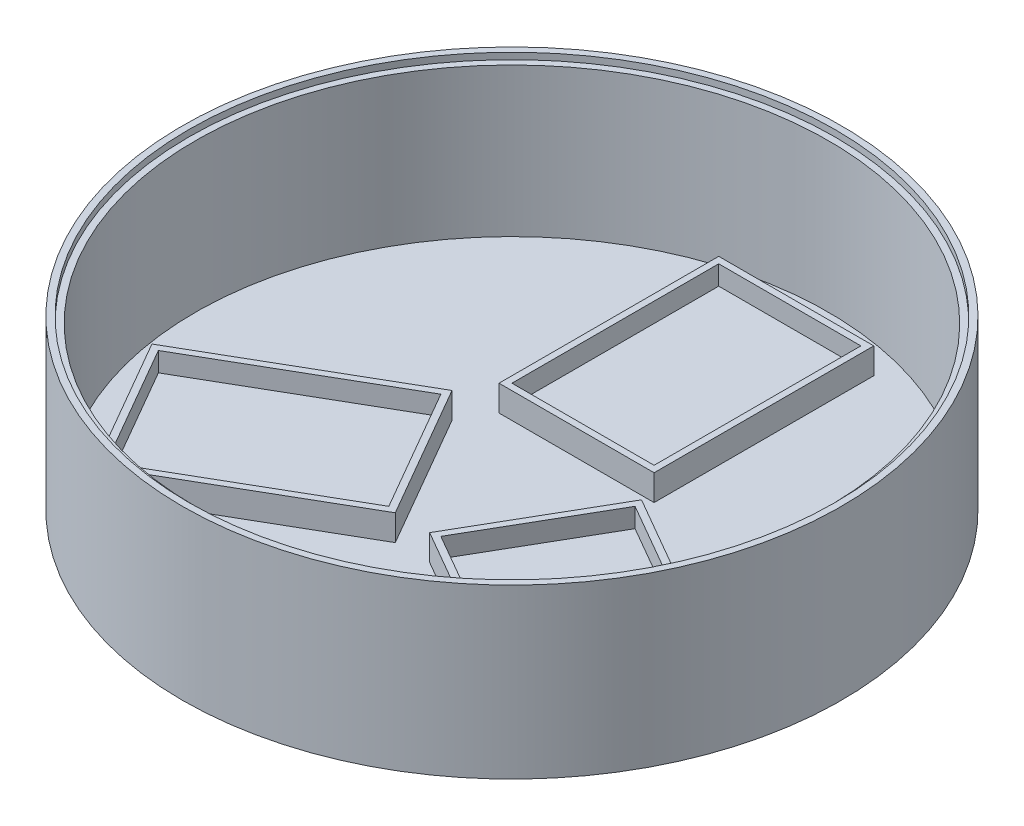
ISO-10303-21;
HEADER;
FILE_DESCRIPTION(('STEP AP214'),'2;1');
FILE_NAME('part.step','',(''),(''),'','','');
FILE_SCHEMA(('AUTOMOTIVE_DESIGN { 1 0 10303 214 1 1 1 1 }'));
ENDSEC;
DATA;
#1=APPLICATION_CONTEXT('core data for automotive mechanical design processes');
#2=APPLICATION_PROTOCOL_DEFINITION('international standard','automotive_design',2000,#1);
#3=PRODUCT_CONTEXT('',#1,'mechanical');
#4=PRODUCT('Part','Part','',(#3));
#5=PRODUCT_RELATED_PRODUCT_CATEGORY('part','',(#4));
#6=PRODUCT_DEFINITION_FORMATION('','',#4);
#7=PRODUCT_DEFINITION_CONTEXT('part definition',#1,'design');
#8=PRODUCT_DEFINITION('design','',#6,#7);
#9=PRODUCT_DEFINITION_SHAPE('','',#8);
#10=(LENGTH_UNIT() NAMED_UNIT(*) SI_UNIT(.MILLI.,.METRE.));
#11=(NAMED_UNIT(*) PLANE_ANGLE_UNIT() SI_UNIT($,.RADIAN.));
#12=(NAMED_UNIT(*) SI_UNIT($,.STERADIAN.) SOLID_ANGLE_UNIT());
#13=UNCERTAINTY_MEASURE_WITH_UNIT(LENGTH_MEASURE(1.E-05),#10,'distance_accuracy_value','');
#14=(GEOMETRIC_REPRESENTATION_CONTEXT(3) GLOBAL_UNCERTAINTY_ASSIGNED_CONTEXT((#13)) GLOBAL_UNIT_ASSIGNED_CONTEXT((#10,
#11,#12)) REPRESENTATION_CONTEXT('',''));
#15=CARTESIAN_POINT('',(0.,0.,0.));
#16=DIRECTION('',(0.,0.,1.));
#17=DIRECTION('',(1.,0.,0.));
#18=AXIS2_PLACEMENT_3D('',#15,#16,#17);
#19=CARTESIAN_POINT('',(0.,125.,0.));
#20=DIRECTION('',(0.,1.,0.));
#21=DIRECTION('',(0.,0.,1.));
#22=AXIS2_PLACEMENT_3D('',#19,#20,#21);
#23=PLANE('',#22);
#24=CARTESIAN_POINT('',(0.,125.,0.));
#25=DIRECTION('',(0.,1.,0.));
#26=DIRECTION('',(0.,0.,1.));
#27=AXIS2_PLACEMENT_3D('',#24,#25,#26);
#28=CIRCLE('',#27,245.);
#29=CARTESIAN_POINT('',(0.,125.,245.));
#30=VERTEX_POINT('',#29);
#31=EDGE_CURVE('E50',#30,#30,#28,.T.);
#32=ORIENTED_EDGE('',*,*,#31,.F.);
#33=EDGE_LOOP('',(#32));
#34=FACE_BOUND('',#33,.T.);
#35=CARTESIAN_POINT('',(0.,125.,0.));
#36=DIRECTION('',(0.,1.,0.));
#37=DIRECTION('',(0.,0.,1.));
#38=AXIS2_PLACEMENT_3D('',#35,#36,#37);
#39=CIRCLE('',#38,250.);
#40=CARTESIAN_POINT('',(0.,125.,250.));
#41=VERTEX_POINT('',#40);
#42=EDGE_CURVE('E331',#41,#41,#39,.T.);
#43=ORIENTED_EDGE('',*,*,#42,.T.);
#44=EDGE_LOOP('',(#43));
#45=FACE_BOUND('',#44,.T.);
#46=ADVANCED_FACE('F41',(#34,#45),#23,.T.);
#47=CARTESIAN_POINT('',(0.,10.,0.));
#48=DIRECTION('',(0.,1.,0.));
#49=DIRECTION('',(0.,0.,1.));
#50=AXIS2_PLACEMENT_3D('',#47,#48,#49);
#51=PLANE('',#50);
#52=CARTESIAN_POINT('',(0.,9.99999999999999,0.));
#53=DIRECTION('',(0.,1.,0.));
#54=DIRECTION('',(0.,0.,1.));
#55=AXIS2_PLACEMENT_3D('',#52,#53,#54);
#56=CIRCLE('',#55,245.);
#57=CARTESIAN_POINT('',(0.,9.99999999999999,245.));
#58=VERTEX_POINT('',#57);
#59=EDGE_CURVE('E474',#58,#58,#56,.T.);
#60=ORIENTED_EDGE('',*,*,#59,.T.);
#61=EDGE_LOOP('',(#60));
#62=FACE_BOUND('',#61,.T.);
#63=DIRECTION('',(-1.,0.,0.));
#64=VECTOR('',#63,1.);
#65=CARTESIAN_POINT('',(-60.,10.,-220.));
#66=LINE('',#65,#64);
#67=CARTESIAN_POINT('',(60.,10.,-220.));
#68=VERTEX_POINT('',#67);
#69=CARTESIAN_POINT('',(-60.,10.,-220.));
#70=VERTEX_POINT('',#69);
#71=EDGE_CURVE('E452',#68,#70,#66,.T.);
#72=ORIENTED_EDGE('',*,*,#71,.F.);
#73=DIRECTION('',(0.,0.,-1.));
#74=VECTOR('',#73,1.);
#75=CARTESIAN_POINT('',(60.,10.,-50.));
#76=LINE('',#75,#74);
#77=CARTESIAN_POINT('',(60.,10.,-50.));
#78=VERTEX_POINT('',#77);
#79=EDGE_CURVE('E433',#78,#68,#76,.T.);
#80=ORIENTED_EDGE('',*,*,#79,.F.);
#81=DIRECTION('',(1.,0.,0.));
#82=VECTOR('',#81,1.);
#83=CARTESIAN_POINT('',(-60.,10.,-50.));
#84=LINE('',#83,#82);
#85=CARTESIAN_POINT('',(-60.,10.,-50.));
#86=VERTEX_POINT('',#85);
#87=EDGE_CURVE('E439',#86,#78,#84,.T.);
#88=ORIENTED_EDGE('',*,*,#87,.F.);
#89=DIRECTION('',(0.,0.,1.));
#90=VECTOR('',#89,1.);
#91=CARTESIAN_POINT('',(-60.,10.,-50.));
#92=LINE('',#91,#90);
#93=EDGE_CURVE('E455',#70,#86,#92,.T.);
#94=ORIENTED_EDGE('',*,*,#93,.F.);
#95=EDGE_LOOP('',(#72,#80,#88,#94));
#96=FACE_BOUND('',#95,.T.);
#97=DIRECTION('',(-0.866025403784439,0.,-0.5));
#98=VECTOR('',#97,1.);
#99=CARTESIAN_POINT('',(73.3012701892239,10.,-26.9615242270708));
#100=LINE('',#99,#98);
#101=CARTESIAN_POINT('',(220.525588832578,10.,58.0384757729292));
#102=VERTEX_POINT('',#101);
#103=CARTESIAN_POINT('',(73.3012701892239,10.,-26.9615242270708));
#104=VERTEX_POINT('',#103);
#105=EDGE_CURVE('E411',#102,#104,#100,.T.);
#106=ORIENTED_EDGE('',*,*,#105,.F.);
#107=DIRECTION('',(0.5,0.,-0.866025403784439));
#108=VECTOR('',#107,1.);
#109=CARTESIAN_POINT('',(220.525588832578,10.,58.0384757729292));
#110=LINE('',#109,#108);
#111=CARTESIAN_POINT('',(160.525588832579,10.,161.961524227062));
#112=VERTEX_POINT('',#111);
#113=EDGE_CURVE('E392',#112,#102,#110,.T.);
#114=ORIENTED_EDGE('',*,*,#113,.F.);
#115=DIRECTION('',(0.866025403784439,0.,0.5));
#116=VECTOR('',#115,1.);
#117=CARTESIAN_POINT('',(13.3012701892239,10.,76.9615242270619));
#118=LINE('',#117,#116);
#119=CARTESIAN_POINT('',(13.3012701892239,10.,76.9615242270618));
#120=VERTEX_POINT('',#119);
#121=EDGE_CURVE('E398',#120,#112,#118,.T.);
#122=ORIENTED_EDGE('',*,*,#121,.F.);
#123=DIRECTION('',(-0.5,0.,0.866025403784439));
#124=VECTOR('',#123,1.);
#125=CARTESIAN_POINT('',(73.3012701892239,10.,-26.9615242270708));
#126=LINE('',#125,#124);
#127=EDGE_CURVE('E414',#104,#120,#126,.T.);
#128=ORIENTED_EDGE('',*,*,#127,.F.);
#129=EDGE_LOOP('',(#106,#114,#122,#128));
#130=FACE_BOUND('',#129,.T.);
#131=DIRECTION('',(0.866025403784438,0.,-0.5));
#132=VECTOR('',#131,1.);
#133=CARTESIAN_POINT('',(-13.3012701892171,10.,76.9615242270658));
#134=LINE('',#133,#132);
#135=CARTESIAN_POINT('',(-160.525588832572,10.,161.961524227066));
#136=VERTEX_POINT('',#135);
#137=CARTESIAN_POINT('',(-13.3012701892171,10.,76.9615242270658));
#138=VERTEX_POINT('',#137);
#139=EDGE_CURVE('E370',#136,#138,#134,.T.);
#140=ORIENTED_EDGE('',*,*,#139,.F.);
#141=DIRECTION('',(0.5,0.,0.866025403784438));
#142=VECTOR('',#141,1.);
#143=CARTESIAN_POINT('',(-160.525588832572,10.,161.961524227066));
#144=LINE('',#143,#142);
#145=CARTESIAN_POINT('',(-220.525588832572,10.,58.0384757729333));
#146=VERTEX_POINT('',#145);
#147=EDGE_CURVE('E351',#146,#136,#144,.T.);
#148=ORIENTED_EDGE('',*,*,#147,.F.);
#149=DIRECTION('',(-0.866025403784438,0.,0.5));
#150=VECTOR('',#149,1.);
#151=CARTESIAN_POINT('',(-73.3012701892171,10.,-26.9615242270668));
#152=LINE('',#151,#150);
#153=CARTESIAN_POINT('',(-73.3012701892171,10.,-26.9615242270668));
#154=VERTEX_POINT('',#153);
#155=EDGE_CURVE('E357',#154,#146,#152,.T.);
#156=ORIENTED_EDGE('',*,*,#155,.F.);
#157=DIRECTION('',(-0.5,0.,-0.866025403784438));
#158=VECTOR('',#157,1.);
#159=CARTESIAN_POINT('',(-13.3012701892171,10.,76.9615242270658));
#160=LINE('',#159,#158);
#161=EDGE_CURVE('E373',#138,#154,#160,.T.);
#162=ORIENTED_EDGE('',*,*,#161,.F.);
#163=EDGE_LOOP('',(#140,#148,#156,#162));
#164=FACE_BOUND('',#163,.T.);
#165=ADVANCED_FACE('F486',(#62,#96,#130,#164),#51,.T.);
#166=CARTESIAN_POINT('',(0.,125.,0.));
#167=DIRECTION('',(0.,-1.,0.));
#168=DIRECTION('',(0.,0.,-1.));
#169=AXIS2_PLACEMENT_3D('',#166,#167,#168);
#170=CYLINDRICAL_SURFACE('',#169,245.);
#171=ORIENTED_EDGE('',*,*,#31,.T.);
#172=EDGE_LOOP('',(#171));
#173=FACE_BOUND('',#172,.T.);
#174=ORIENTED_EDGE('',*,*,#59,.F.);
#175=EDGE_LOOP('',(#174));
#176=FACE_BOUND('',#175,.T.);
#177=ADVANCED_FACE('F481',(#173,#176),#170,.F.);
#178=CARTESIAN_POINT('',(60.,30.,-50.));
#179=DIRECTION('',(-1.,0.,0.));
#180=DIRECTION('',(0.,0.,1.));
#181=AXIS2_PLACEMENT_3D('',#178,#179,#180);
#182=PLANE('',#181);
#183=ORIENTED_EDGE('',*,*,#79,.T.);
#184=DIRECTION('',(0.,-1.,0.));
#185=VECTOR('',#184,1.);
#186=CARTESIAN_POINT('',(60.,30.,-220.));
#187=LINE('',#186,#185);
#188=CARTESIAN_POINT('',(60.,30.,-220.));
#189=VERTEX_POINT('',#188);
#190=EDGE_CURVE('E471',#189,#68,#187,.T.);
#191=ORIENTED_EDGE('',*,*,#190,.F.);
#192=DIRECTION('',(0.,0.,-1.));
#193=VECTOR('',#192,1.);
#194=CARTESIAN_POINT('',(60.,30.,-50.));
#195=LINE('',#194,#193);
#196=CARTESIAN_POINT('',(60.,30.,-50.));
#197=VERTEX_POINT('',#196);
#198=EDGE_CURVE('E434',#197,#189,#195,.T.);
#199=ORIENTED_EDGE('',*,*,#198,.F.);
#200=DIRECTION('',(0.,-1.,0.));
#201=VECTOR('',#200,1.);
#202=CARTESIAN_POINT('',(60.,30.,-50.));
#203=LINE('',#202,#201);
#204=EDGE_CURVE('E448',#197,#78,#203,.T.);
#205=ORIENTED_EDGE('',*,*,#204,.T.);
#206=EDGE_LOOP('',(#183,#191,#199,#205));
#207=FACE_BOUND('',#206,.T.);
#208=ADVANCED_FACE('F562',(#207),#182,.F.);
#209=CARTESIAN_POINT('',(-60.,30.,-220.));
#210=DIRECTION('',(0.,0.,1.));
#211=DIRECTION('',(1.,0.,0.));
#212=AXIS2_PLACEMENT_3D('',#209,#210,#211);
#213=PLANE('',#212);
#214=ORIENTED_EDGE('',*,*,#71,.T.);
#215=DIRECTION('',(0.,-1.,0.));
#216=VECTOR('',#215,1.);
#217=CARTESIAN_POINT('',(-60.,30.,-220.));
#218=LINE('',#217,#216);
#219=CARTESIAN_POINT('',(-60.,30.,-220.));
#220=VERTEX_POINT('',#219);
#221=EDGE_CURVE('E467',#220,#70,#218,.T.);
#222=ORIENTED_EDGE('',*,*,#221,.F.);
#223=DIRECTION('',(-1.,0.,0.));
#224=VECTOR('',#223,1.);
#225=CARTESIAN_POINT('',(-60.,30.,-220.));
#226=LINE('',#225,#224);
#227=EDGE_CURVE('E438',#189,#220,#226,.T.);
#228=ORIENTED_EDGE('',*,*,#227,.F.);
#229=ORIENTED_EDGE('',*,*,#190,.T.);
#230=EDGE_LOOP('',(#214,#222,#228,#229));
#231=FACE_BOUND('',#230,.T.);
#232=ADVANCED_FACE('F558',(#231),#213,.F.);
#233=CARTESIAN_POINT('',(-60.,30.,-50.));
#234=DIRECTION('',(1.,0.,0.));
#235=DIRECTION('',(0.,0.,-1.));
#236=AXIS2_PLACEMENT_3D('',#233,#234,#235);
#237=PLANE('',#236);
#238=ORIENTED_EDGE('',*,*,#93,.T.);
#239=DIRECTION('',(0.,-1.,0.));
#240=VECTOR('',#239,1.);
#241=CARTESIAN_POINT('',(-60.,30.,-50.));
#242=LINE('',#241,#240);
#243=CARTESIAN_POINT('',(-60.,30.,-50.));
#244=VERTEX_POINT('',#243);
#245=EDGE_CURVE('E464',#244,#86,#242,.T.);
#246=ORIENTED_EDGE('',*,*,#245,.F.);
#247=DIRECTION('',(0.,0.,1.));
#248=VECTOR('',#247,1.);
#249=CARTESIAN_POINT('',(-60.,30.,-50.));
#250=LINE('',#249,#248);
#251=EDGE_CURVE('E442',#220,#244,#250,.T.);
#252=ORIENTED_EDGE('',*,*,#251,.F.);
#253=ORIENTED_EDGE('',*,*,#221,.T.);
#254=EDGE_LOOP('',(#238,#246,#252,#253));
#255=FACE_BOUND('',#254,.T.);
#256=ADVANCED_FACE('F554',(#255),#237,.F.);
#257=CARTESIAN_POINT('',(-60.,30.,-50.));
#258=DIRECTION('',(0.,0.,-1.));
#259=DIRECTION('',(-1.,0.,0.));
#260=AXIS2_PLACEMENT_3D('',#257,#258,#259);
#261=PLANE('',#260);
#262=ORIENTED_EDGE('',*,*,#87,.T.);
#263=ORIENTED_EDGE('',*,*,#204,.F.);
#264=DIRECTION('',(1.,0.,0.));
#265=VECTOR('',#264,1.);
#266=CARTESIAN_POINT('',(-60.,30.,-50.));
#267=LINE('',#266,#265);
#268=EDGE_CURVE('E445',#244,#197,#267,.T.);
#269=ORIENTED_EDGE('',*,*,#268,.F.);
#270=ORIENTED_EDGE('',*,*,#245,.T.);
#271=EDGE_LOOP('',(#262,#263,#269,#270));
#272=FACE_BOUND('',#271,.T.);
#273=ADVANCED_FACE('F550',(#272),#261,.F.);
#274=CARTESIAN_POINT('',(0.,30.,0.));
#275=DIRECTION('',(0.,-1.,0.));
#276=DIRECTION('',(0.,0.,-1.));
#277=AXIS2_PLACEMENT_3D('',#274,#275,#276);
#278=PLANE('',#277);
#279=DIRECTION('',(0.,0.,-1.));
#280=VECTOR('',#279,1.);
#281=CARTESIAN_POINT('',(55.,30.,-55.));
#282=LINE('',#281,#280);
#283=CARTESIAN_POINT('',(55.,30.,-55.));
#284=VERTEX_POINT('',#283);
#285=CARTESIAN_POINT('',(55.,30.,-215.));
#286=VERTEX_POINT('',#285);
#287=EDGE_CURVE('E239',#284,#286,#282,.T.);
#288=ORIENTED_EDGE('',*,*,#287,.F.);
#289=DIRECTION('',(1.,0.,0.));
#290=VECTOR('',#289,1.);
#291=CARTESIAN_POINT('',(-55.,30.,-55.));
#292=LINE('',#291,#290);
#293=CARTESIAN_POINT('',(-55.,30.,-55.));
#294=VERTEX_POINT('',#293);
#295=EDGE_CURVE('E57',#294,#284,#292,.T.);
#296=ORIENTED_EDGE('',*,*,#295,.F.);
#297=DIRECTION('',(0.,0.,1.));
#298=VECTOR('',#297,1.);
#299=CARTESIAN_POINT('',(-55.,30.,-215.));
#300=LINE('',#299,#298);
#301=CARTESIAN_POINT('',(-55.,30.,-215.));
#302=VERTEX_POINT('',#301);
#303=EDGE_CURVE('E226',#302,#294,#300,.T.);
#304=ORIENTED_EDGE('',*,*,#303,.F.);
#305=DIRECTION('',(-1.,0.,0.));
#306=VECTOR('',#305,1.);
#307=CARTESIAN_POINT('',(55.,30.,-215.));
#308=LINE('',#307,#306);
#309=EDGE_CURVE('E230',#286,#302,#308,.T.);
#310=ORIENTED_EDGE('',*,*,#309,.F.);
#311=EDGE_LOOP('',(#288,#296,#304,#310));
#312=FACE_BOUND('',#311,.T.);
#313=ORIENTED_EDGE('',*,*,#198,.T.);
#314=ORIENTED_EDGE('',*,*,#227,.T.);
#315=ORIENTED_EDGE('',*,*,#251,.T.);
#316=ORIENTED_EDGE('',*,*,#268,.T.);
#317=EDGE_LOOP('',(#313,#314,#315,#316));
#318=FACE_BOUND('',#317,.T.);
#319=ADVANCED_FACE('F546',(#312,#318),#278,.F.);
#320=CARTESIAN_POINT('',(220.525588832578,30.,58.0384757729292));
#321=DIRECTION('',(-0.866025403784439,0.,-0.5));
#322=DIRECTION('',(-0.5,0.,0.866025403784439));
#323=AXIS2_PLACEMENT_3D('',#320,#321,#322);
#324=PLANE('',#323);
#325=ORIENTED_EDGE('',*,*,#113,.T.);
#326=DIRECTION('',(0.,-1.,0.));
#327=VECTOR('',#326,1.);
#328=CARTESIAN_POINT('',(220.525588832578,30.,58.0384757729292));
#329=LINE('',#328,#327);
#330=CARTESIAN_POINT('',(220.525588832578,30.,58.0384757729292));
#331=VERTEX_POINT('',#330);
#332=EDGE_CURVE('E430',#331,#102,#329,.T.);
#333=ORIENTED_EDGE('',*,*,#332,.F.);
#334=DIRECTION('',(0.5,0.,-0.866025403784439));
#335=VECTOR('',#334,1.);
#336=CARTESIAN_POINT('',(220.525588832578,30.,58.0384757729292));
#337=LINE('',#336,#335);
#338=CARTESIAN_POINT('',(160.525588832579,30.,161.961524227062));
#339=VERTEX_POINT('',#338);
#340=EDGE_CURVE('E393',#339,#331,#337,.T.);
#341=ORIENTED_EDGE('',*,*,#340,.F.);
#342=DIRECTION('',(0.,-1.,0.));
#343=VECTOR('',#342,1.);
#344=CARTESIAN_POINT('',(160.525588832579,30.,161.961524227062));
#345=LINE('',#344,#343);
#346=EDGE_CURVE('E407',#339,#112,#345,.T.);
#347=ORIENTED_EDGE('',*,*,#346,.T.);
#348=EDGE_LOOP('',(#325,#333,#341,#347));
#349=FACE_BOUND('',#348,.T.);
#350=ADVANCED_FACE('F542',(#349),#324,.F.);
#351=CARTESIAN_POINT('',(73.3012701892239,30.,-26.9615242270708));
#352=DIRECTION('',(-0.5,0.,0.866025403784439));
#353=DIRECTION('',(0.866025403784439,0.,0.5));
#354=AXIS2_PLACEMENT_3D('',#351,#352,#353);
#355=PLANE('',#354);
#356=ORIENTED_EDGE('',*,*,#105,.T.);
#357=DIRECTION('',(0.,-1.,0.));
#358=VECTOR('',#357,1.);
#359=CARTESIAN_POINT('',(73.3012701892239,30.,-26.9615242270708));
#360=LINE('',#359,#358);
#361=CARTESIAN_POINT('',(73.3012701892239,30.,-26.9615242270708));
#362=VERTEX_POINT('',#361);
#363=EDGE_CURVE('E426',#362,#104,#360,.T.);
#364=ORIENTED_EDGE('',*,*,#363,.F.);
#365=DIRECTION('',(-0.866025403784439,0.,-0.5));
#366=VECTOR('',#365,1.);
#367=CARTESIAN_POINT('',(73.3012701892239,30.,-26.9615242270708));
#368=LINE('',#367,#366);
#369=EDGE_CURVE('E397',#331,#362,#368,.T.);
#370=ORIENTED_EDGE('',*,*,#369,.F.);
#371=ORIENTED_EDGE('',*,*,#332,.T.);
#372=EDGE_LOOP('',(#356,#364,#370,#371));
#373=FACE_BOUND('',#372,.T.);
#374=ADVANCED_FACE('F538',(#373),#355,.F.);
#375=CARTESIAN_POINT('',(73.3012701892239,30.,-26.9615242270708));
#376=DIRECTION('',(0.866025403784439,0.,0.5));
#377=DIRECTION('',(0.5,0.,-0.866025403784439));
#378=AXIS2_PLACEMENT_3D('',#375,#376,#377);
#379=PLANE('',#378);
#380=ORIENTED_EDGE('',*,*,#127,.T.);
#381=DIRECTION('',(0.,-1.,0.));
#382=VECTOR('',#381,1.);
#383=CARTESIAN_POINT('',(13.3012701892239,30.,76.9615242270619));
#384=LINE('',#383,#382);
#385=CARTESIAN_POINT('',(13.3012701892239,30.,76.9615242270619));
#386=VERTEX_POINT('',#385);
#387=EDGE_CURVE('E423',#386,#120,#384,.T.);
#388=ORIENTED_EDGE('',*,*,#387,.F.);
#389=DIRECTION('',(-0.5,0.,0.866025403784439));
#390=VECTOR('',#389,1.);
#391=CARTESIAN_POINT('',(73.3012701892239,30.,-26.9615242270708));
#392=LINE('',#391,#390);
#393=EDGE_CURVE('E401',#362,#386,#392,.T.);
#394=ORIENTED_EDGE('',*,*,#393,.F.);
#395=ORIENTED_EDGE('',*,*,#363,.T.);
#396=EDGE_LOOP('',(#380,#388,#394,#395));
#397=FACE_BOUND('',#396,.T.);
#398=ADVANCED_FACE('F534',(#397),#379,.F.);
#399=CARTESIAN_POINT('',(13.3012701892239,30.,76.9615242270619));
#400=DIRECTION('',(0.5,0.,-0.866025403784439));
#401=DIRECTION('',(-0.866025403784439,0.,-0.5));
#402=AXIS2_PLACEMENT_3D('',#399,#400,#401);
#403=PLANE('',#402);
#404=ORIENTED_EDGE('',*,*,#121,.T.);
#405=ORIENTED_EDGE('',*,*,#346,.F.);
#406=DIRECTION('',(0.866025403784439,0.,0.5));
#407=VECTOR('',#406,1.);
#408=CARTESIAN_POINT('',(13.3012701892239,30.,76.9615242270619));
#409=LINE('',#408,#407);
#410=EDGE_CURVE('E404',#386,#339,#409,.T.);
#411=ORIENTED_EDGE('',*,*,#410,.F.);
#412=ORIENTED_EDGE('',*,*,#387,.T.);
#413=EDGE_LOOP('',(#404,#405,#411,#412));
#414=FACE_BOUND('',#413,.T.);
#415=ADVANCED_FACE('F530',(#414),#403,.F.);
#416=CARTESIAN_POINT('',(0.,30.,0.));
#417=DIRECTION('',(0.,1.,0.));
#418=DIRECTION('',(0.,0.,1.));
#419=AXIS2_PLACEMENT_3D('',#416,#417,#418);
#420=PLANE('',#419);
#421=DIRECTION('',(-0.500000000000004,0.,0.866025403784436));
#422=VECTOR('',#421,1.);
#423=CARTESIAN_POINT('',(75.1313972081442,30.,-20.1313972081438));
#424=LINE('',#423,#422);
#425=CARTESIAN_POINT('',(75.1313972081442,30.,-20.1313972081438));
#426=VERTEX_POINT('',#425);
#427=CARTESIAN_POINT('',(20.1313972081438,30.,75.1313972081442));
#428=VERTEX_POINT('',#427);
#429=EDGE_CURVE('E65',#426,#428,#424,.T.);
#430=ORIENTED_EDGE('',*,*,#429,.F.);
#431=DIRECTION('',(-0.866025403784436,0.,-0.500000000000004));
#432=VECTOR('',#431,1.);
#433=CARTESIAN_POINT('',(213.695461813654,30.,59.8686027918569));
#434=LINE('',#433,#432);
#435=CARTESIAN_POINT('',(213.695461813654,30.,59.8686027918569));
#436=VERTEX_POINT('',#435);
#437=EDGE_CURVE('E302',#436,#426,#434,.T.);
#438=ORIENTED_EDGE('',*,*,#437,.F.);
#439=DIRECTION('',(0.500000000000004,0.,-0.866025403784436));
#440=VECTOR('',#439,1.);
#441=CARTESIAN_POINT('',(158.695461813654,30.,155.131397208145));
#442=LINE('',#441,#440);
#443=CARTESIAN_POINT('',(158.695461813654,30.,155.131397208145));
#444=VERTEX_POINT('',#443);
#445=EDGE_CURVE('E321',#444,#436,#442,.T.);
#446=ORIENTED_EDGE('',*,*,#445,.F.);
#447=DIRECTION('',(0.866025403784436,0.,0.500000000000004));
#448=VECTOR('',#447,1.);
#449=CARTESIAN_POINT('',(20.1313972081438,30.,75.1313972081442));
#450=LINE('',#449,#448);
#451=EDGE_CURVE('E317',#428,#444,#450,.T.);
#452=ORIENTED_EDGE('',*,*,#451,.F.);
#453=EDGE_LOOP('',(#430,#438,#446,#452));
#454=FACE_BOUND('',#453,.T.);
#455=ORIENTED_EDGE('',*,*,#340,.T.);
#456=ORIENTED_EDGE('',*,*,#369,.T.);
#457=ORIENTED_EDGE('',*,*,#393,.T.);
#458=ORIENTED_EDGE('',*,*,#410,.T.);
#459=EDGE_LOOP('',(#455,#456,#457,#458));
#460=FACE_BOUND('',#459,.T.);
#461=ADVANCED_FACE('F526',(#454,#460),#420,.T.);
#462=CARTESIAN_POINT('',(-160.525588832572,30.,161.961524227066));
#463=DIRECTION('',(0.866025403784438,0.,-0.5));
#464=DIRECTION('',(-0.5,0.,-0.866025403784438));
#465=AXIS2_PLACEMENT_3D('',#462,#463,#464);
#466=PLANE('',#465);
#467=ORIENTED_EDGE('',*,*,#147,.T.);
#468=DIRECTION('',(0.,-1.,0.));
#469=VECTOR('',#468,1.);
#470=CARTESIAN_POINT('',(-160.525588832572,30.,161.961524227066));
#471=LINE('',#470,#469);
#472=CARTESIAN_POINT('',(-160.525588832572,30.,161.961524227066));
#473=VERTEX_POINT('',#472);
#474=EDGE_CURVE('E389',#473,#136,#471,.T.);
#475=ORIENTED_EDGE('',*,*,#474,.F.);
#476=DIRECTION('',(0.5,0.,0.866025403784438));
#477=VECTOR('',#476,1.);
#478=CARTESIAN_POINT('',(-160.525588832572,30.,161.961524227066));
#479=LINE('',#478,#477);
#480=CARTESIAN_POINT('',(-220.525588832572,30.,58.0384757729333));
#481=VERTEX_POINT('',#480);
#482=EDGE_CURVE('E352',#481,#473,#479,.T.);
#483=ORIENTED_EDGE('',*,*,#482,.F.);
#484=DIRECTION('',(0.,-1.,0.));
#485=VECTOR('',#484,1.);
#486=CARTESIAN_POINT('',(-220.525588832572,30.,58.0384757729333));
#487=LINE('',#486,#485);
#488=EDGE_CURVE('E366',#481,#146,#487,.T.);
#489=ORIENTED_EDGE('',*,*,#488,.T.);
#490=EDGE_LOOP('',(#467,#475,#483,#489));
#491=FACE_BOUND('',#490,.T.);
#492=ADVANCED_FACE('F522',(#491),#466,.F.);
#493=CARTESIAN_POINT('',(-13.3012701892171,30.,76.9615242270658));
#494=DIRECTION('',(-0.5,0.,-0.866025403784438));
#495=DIRECTION('',(-0.866025403784438,0.,0.5));
#496=AXIS2_PLACEMENT_3D('',#493,#494,#495);
#497=PLANE('',#496);
#498=ORIENTED_EDGE('',*,*,#139,.T.);
#499=DIRECTION('',(0.,-1.,0.));
#500=VECTOR('',#499,1.);
#501=CARTESIAN_POINT('',(-13.3012701892171,30.,76.9615242270658));
#502=LINE('',#501,#500);
#503=CARTESIAN_POINT('',(-13.3012701892171,30.,76.9615242270658));
#504=VERTEX_POINT('',#503);
#505=EDGE_CURVE('E385',#504,#138,#502,.T.);
#506=ORIENTED_EDGE('',*,*,#505,.F.);
#507=DIRECTION('',(0.866025403784438,0.,-0.5));
#508=VECTOR('',#507,1.);
#509=CARTESIAN_POINT('',(-13.3012701892171,30.,76.9615242270658));
#510=LINE('',#509,#508);
#511=EDGE_CURVE('E356',#473,#504,#510,.T.);
#512=ORIENTED_EDGE('',*,*,#511,.F.);
#513=ORIENTED_EDGE('',*,*,#474,.T.);
#514=EDGE_LOOP('',(#498,#506,#512,#513));
#515=FACE_BOUND('',#514,.T.);
#516=ADVANCED_FACE('F518',(#515),#497,.F.);
#517=CARTESIAN_POINT('',(-13.3012701892171,30.,76.9615242270658));
#518=DIRECTION('',(-0.866025403784438,0.,0.5));
#519=DIRECTION('',(0.5,0.,0.866025403784438));
#520=AXIS2_PLACEMENT_3D('',#517,#518,#519);
#521=PLANE('',#520);
#522=ORIENTED_EDGE('',*,*,#161,.T.);
#523=DIRECTION('',(0.,-1.,0.));
#524=VECTOR('',#523,1.);
#525=CARTESIAN_POINT('',(-73.3012701892171,30.,-26.9615242270668));
#526=LINE('',#525,#524);
#527=CARTESIAN_POINT('',(-73.3012701892171,30.,-26.9615242270668));
#528=VERTEX_POINT('',#527);
#529=EDGE_CURVE('E382',#528,#154,#526,.T.);
#530=ORIENTED_EDGE('',*,*,#529,.F.);
#531=DIRECTION('',(-0.5,0.,-0.866025403784438));
#532=VECTOR('',#531,1.);
#533=CARTESIAN_POINT('',(-13.3012701892171,30.,76.9615242270658));
#534=LINE('',#533,#532);
#535=EDGE_CURVE('E360',#504,#528,#534,.T.);
#536=ORIENTED_EDGE('',*,*,#535,.F.);
#537=ORIENTED_EDGE('',*,*,#505,.T.);
#538=EDGE_LOOP('',(#522,#530,#536,#537));
#539=FACE_BOUND('',#538,.T.);
#540=ADVANCED_FACE('F514',(#539),#521,.F.);
#541=CARTESIAN_POINT('',(-73.3012701892171,30.,-26.9615242270668));
#542=DIRECTION('',(0.5,0.,0.866025403784438));
#543=DIRECTION('',(0.866025403784438,0.,-0.5));
#544=AXIS2_PLACEMENT_3D('',#541,#542,#543);
#545=PLANE('',#544);
#546=ORIENTED_EDGE('',*,*,#155,.T.);
#547=ORIENTED_EDGE('',*,*,#488,.F.);
#548=DIRECTION('',(-0.866025403784438,0.,0.5));
#549=VECTOR('',#548,1.);
#550=CARTESIAN_POINT('',(-73.3012701892171,30.,-26.9615242270668));
#551=LINE('',#550,#549);
#552=EDGE_CURVE('E363',#528,#481,#551,.T.);
#553=ORIENTED_EDGE('',*,*,#552,.F.);
#554=ORIENTED_EDGE('',*,*,#529,.T.);
#555=EDGE_LOOP('',(#546,#547,#553,#554));
#556=FACE_BOUND('',#555,.T.);
#557=ADVANCED_FACE('F510',(#556),#545,.F.);
#558=CARTESIAN_POINT('',(0.,30.,0.));
#559=DIRECTION('',(0.,1.,0.));
#560=DIRECTION('',(0.,0.,1.));
#561=AXIS2_PLACEMENT_3D('',#558,#559,#560);
#562=PLANE('',#561);
#563=DIRECTION('',(-0.499999999999992,0.,-0.866025403784443));
#564=VECTOR('',#563,1.);
#565=CARTESIAN_POINT('',(-20.1313972081448,30.,75.1313972081439));
#566=LINE('',#565,#564);
#567=CARTESIAN_POINT('',(-20.1313972081448,30.,75.1313972081439));
#568=VERTEX_POINT('',#567);
#569=CARTESIAN_POINT('',(-75.131397208144,30.,-20.1313972081448));
#570=VERTEX_POINT('',#569);
#571=EDGE_CURVE('E272',#568,#570,#566,.T.);
#572=ORIENTED_EDGE('',*,*,#571,.F.);
#573=DIRECTION('',(0.866025403784426,0.,-0.500000000000023));
#574=VECTOR('',#573,1.);
#575=CARTESIAN_POINT('',(-158.695461813653,30.,155.131397208148));
#576=LINE('',#575,#574);
#577=CARTESIAN_POINT('',(-158.695461813653,30.,155.131397208148));
#578=VERTEX_POINT('',#577);
#579=EDGE_CURVE('E259',#578,#568,#576,.T.);
#580=ORIENTED_EDGE('',*,*,#579,.F.);
#581=DIRECTION('',(0.5,0.,0.866025403784438));
#582=VECTOR('',#581,1.);
#583=CARTESIAN_POINT('',(-213.695461813653,30.,59.8686027918596));
#584=LINE('',#583,#582);
#585=CARTESIAN_POINT('',(-213.695461813653,30.,59.8686027918596));
#586=VERTEX_POINT('',#585);
#587=EDGE_CURVE('E279',#586,#578,#584,.T.);
#588=ORIENTED_EDGE('',*,*,#587,.F.);
#589=DIRECTION('',(-0.866025403784426,0.,0.500000000000023));
#590=VECTOR('',#589,1.);
#591=CARTESIAN_POINT('',(-75.131397208144,30.,-20.1313972081448));
#592=LINE('',#591,#590);
#593=EDGE_CURVE('E275',#570,#586,#592,.T.);
#594=ORIENTED_EDGE('',*,*,#593,.F.);
#595=EDGE_LOOP('',(#572,#580,#588,#594));
#596=FACE_BOUND('',#595,.T.);
#597=ORIENTED_EDGE('',*,*,#482,.T.);
#598=ORIENTED_EDGE('',*,*,#511,.T.);
#599=ORIENTED_EDGE('',*,*,#535,.T.);
#600=ORIENTED_EDGE('',*,*,#552,.T.);
#601=EDGE_LOOP('',(#597,#598,#599,#600));
#602=FACE_BOUND('',#601,.T.);
#603=ADVANCED_FACE('F501',(#596,#602),#562,.T.);
#604=CARTESIAN_POINT('',(0.,130.,0.));
#605=DIRECTION('',(0.,1.,0.));
#606=DIRECTION('',(0.,0.,1.));
#607=AXIS2_PLACEMENT_3D('',#604,#605,#606);
#608=PLANE('',#607);
#609=CARTESIAN_POINT('',(0.,130.,0.));
#610=DIRECTION('',(0.,1.,0.));
#611=DIRECTION('',(0.,0.,1.));
#612=AXIS2_PLACEMENT_3D('',#609,#610,#611);
#613=CIRCLE('',#612,255.);
#614=CARTESIAN_POINT('',(0.,130.,255.));
#615=VERTEX_POINT('',#614);
#616=EDGE_CURVE('E344',#615,#615,#613,.T.);
#617=ORIENTED_EDGE('',*,*,#616,.T.);
#618=EDGE_LOOP('',(#617));
#619=FACE_BOUND('',#618,.T.);
#620=CARTESIAN_POINT('',(0.,130.,0.));
#621=DIRECTION('',(0.,1.,0.));
#622=DIRECTION('',(0.,0.,1.));
#623=AXIS2_PLACEMENT_3D('',#620,#621,#622);
#624=CIRCLE('',#623,250.);
#625=CARTESIAN_POINT('',(0.,130.,250.));
#626=VERTEX_POINT('',#625);
#627=EDGE_CURVE('E340',#626,#626,#624,.T.);
#628=ORIENTED_EDGE('',*,*,#627,.F.);
#629=EDGE_LOOP('',(#628));
#630=FACE_BOUND('',#629,.T.);
#631=ADVANCED_FACE('F493',(#619,#630),#608,.T.);
#632=CARTESIAN_POINT('',(0.,130.,0.));
#633=DIRECTION('',(0.,-1.,0.));
#634=DIRECTION('',(0.,0.,-1.));
#635=AXIS2_PLACEMENT_3D('',#632,#633,#634);
#636=CYLINDRICAL_SURFACE('',#635,250.);
#637=ORIENTED_EDGE('',*,*,#627,.T.);
#638=EDGE_LOOP('',(#637));
#639=FACE_BOUND('',#638,.T.);
#640=ORIENTED_EDGE('',*,*,#42,.F.);
#641=EDGE_LOOP('',(#640));
#642=FACE_BOUND('',#641,.T.);
#643=ADVANCED_FACE('F490',(#639,#642),#636,.F.);
#644=CARTESIAN_POINT('',(0.,0.,0.));
#645=DIRECTION('',(0.,1.,0.));
#646=DIRECTION('',(0.,0.,1.));
#647=AXIS2_PLACEMENT_3D('',#644,#645,#646);
#648=PLANE('',#647);
#649=CARTESIAN_POINT('',(0.,0.,0.));
#650=DIRECTION('',(0.,1.,0.));
#651=DIRECTION('',(0.,0.,1.));
#652=AXIS2_PLACEMENT_3D('',#649,#650,#651);
#653=CIRCLE('',#652,255.);
#654=CARTESIAN_POINT('',(0.,0.,255.));
#655=VERTEX_POINT('',#654);
#656=EDGE_CURVE('E11',#655,#655,#653,.T.);
#657=ORIENTED_EDGE('',*,*,#656,.F.);
#658=EDGE_LOOP('',(#657));
#659=FACE_BOUND('',#658,.T.);
#660=ADVANCED_FACE('F492',(#659),#648,.F.);
#661=CARTESIAN_POINT('',(0.,125.,0.));
#662=DIRECTION('',(0.,-1.,0.));
#663=DIRECTION('',(0.,0.,-1.));
#664=AXIS2_PLACEMENT_3D('',#661,#662,#663);
#665=CYLINDRICAL_SURFACE('',#664,255.);
#666=ORIENTED_EDGE('',*,*,#656,.T.);
#667=EDGE_LOOP('',(#666));
#668=FACE_BOUND('',#667,.T.);
#669=ORIENTED_EDGE('',*,*,#616,.F.);
#670=EDGE_LOOP('',(#669));
#671=FACE_BOUND('',#670,.T.);
#672=ADVANCED_FACE('F43',(#668,#671),#665,.T.);
#673=CARTESIAN_POINT('',(-20.1313972081448,15.,75.1313972081439));
#674=DIRECTION('',(0.866025403784443,0.,-0.499999999999992));
#675=DIRECTION('',(-0.499999999999992,0.,-0.866025403784443));
#676=AXIS2_PLACEMENT_3D('',#673,#674,#675);
#677=PLANE('',#676);
#678=ORIENTED_EDGE('',*,*,#571,.T.);
#679=DIRECTION('',(0.,1.,0.));
#680=VECTOR('',#679,1.);
#681=CARTESIAN_POINT('',(-75.131397208144,15.,-20.1313972081448));
#682=LINE('',#681,#680);
#683=CARTESIAN_POINT('',(-75.131397208144,15.,-20.1313972081448));
#684=VERTEX_POINT('',#683);
#685=EDGE_CURVE('E271',#684,#570,#682,.T.);
#686=ORIENTED_EDGE('',*,*,#685,.F.);
#687=DIRECTION('',(-0.499999999999992,0.,-0.866025403784443));
#688=VECTOR('',#687,1.);
#689=CARTESIAN_POINT('',(-20.1313972081448,15.,75.1313972081439));
#690=LINE('',#689,#688);
#691=CARTESIAN_POINT('',(-20.1313972081448,15.,75.1313972081439));
#692=VERTEX_POINT('',#691);
#693=EDGE_CURVE('E254',#692,#684,#690,.T.);
#694=ORIENTED_EDGE('',*,*,#693,.F.);
#695=DIRECTION('',(0.,1.,0.));
#696=VECTOR('',#695,1.);
#697=CARTESIAN_POINT('',(-20.1313972081448,15.,75.1313972081439));
#698=LINE('',#697,#696);
#699=EDGE_CURVE('E240',#692,#568,#698,.T.);
#700=ORIENTED_EDGE('',*,*,#699,.T.);
#701=EDGE_LOOP('',(#678,#686,#694,#700));
#702=FACE_BOUND('',#701,.T.);
#703=ADVANCED_FACE('F700',(#702),#677,.F.);
#704=CARTESIAN_POINT('',(-158.695461813653,15.,155.131397208148));
#705=DIRECTION('',(0.500000000000023,0.,0.866025403784426));
#706=DIRECTION('',(0.866025403784426,0.,-0.500000000000023));
#707=AXIS2_PLACEMENT_3D('',#704,#705,#706);
#708=PLANE('',#707);
#709=ORIENTED_EDGE('',*,*,#579,.T.);
#710=ORIENTED_EDGE('',*,*,#699,.F.);
#711=DIRECTION('',(0.866025403784426,0.,-0.500000000000023));
#712=VECTOR('',#711,1.);
#713=CARTESIAN_POINT('',(-158.695461813653,15.,155.131397208148));
#714=LINE('',#713,#712);
#715=CARTESIAN_POINT('',(-158.695461813653,15.,155.131397208148));
#716=VERTEX_POINT('',#715);
#717=EDGE_CURVE('E267',#716,#692,#714,.T.);
#718=ORIENTED_EDGE('',*,*,#717,.F.);
#719=DIRECTION('',(0.,1.,0.));
#720=VECTOR('',#719,1.);
#721=CARTESIAN_POINT('',(-158.695461813653,15.,155.131397208148));
#722=LINE('',#721,#720);
#723=EDGE_CURVE('E288',#716,#578,#722,.T.);
#724=ORIENTED_EDGE('',*,*,#723,.T.);
#725=EDGE_LOOP('',(#709,#710,#718,#724));
#726=FACE_BOUND('',#725,.T.);
#727=ADVANCED_FACE('F711',(#726),#708,.F.);
#728=CARTESIAN_POINT('',(-213.695461813653,15.,59.8686027918596));
#729=DIRECTION('',(-0.866025403784438,0.,0.5));
#730=DIRECTION('',(0.5,0.,0.866025403784438));
#731=AXIS2_PLACEMENT_3D('',#728,#729,#730);
#732=PLANE('',#731);
#733=ORIENTED_EDGE('',*,*,#587,.T.);
#734=ORIENTED_EDGE('',*,*,#723,.F.);
#735=DIRECTION('',(0.5,0.,0.866025403784438));
#736=VECTOR('',#735,1.);
#737=CARTESIAN_POINT('',(-213.695461813653,15.,59.8686027918596));
#738=LINE('',#737,#736);
#739=CARTESIAN_POINT('',(-213.695461813653,15.,59.8686027918596));
#740=VERTEX_POINT('',#739);
#741=EDGE_CURVE('E263',#740,#716,#738,.T.);
#742=ORIENTED_EDGE('',*,*,#741,.F.);
#743=DIRECTION('',(0.,1.,0.));
#744=VECTOR('',#743,1.);
#745=CARTESIAN_POINT('',(-213.695461813653,15.,59.8686027918596));
#746=LINE('',#745,#744);
#747=EDGE_CURVE('E291',#740,#586,#746,.T.);
#748=ORIENTED_EDGE('',*,*,#747,.T.);
#749=EDGE_LOOP('',(#733,#734,#742,#748));
#750=FACE_BOUND('',#749,.T.);
#751=ADVANCED_FACE('F718',(#750),#732,.F.);
#752=CARTESIAN_POINT('',(-75.131397208144,15.,-20.1313972081448));
#753=DIRECTION('',(-0.500000000000023,0.,-0.866025403784426));
#754=DIRECTION('',(-0.866025403784426,0.,0.500000000000023));
#755=AXIS2_PLACEMENT_3D('',#752,#753,#754);
#756=PLANE('',#755);
#757=ORIENTED_EDGE('',*,*,#593,.T.);
#758=ORIENTED_EDGE('',*,*,#747,.F.);
#759=DIRECTION('',(-0.866025403784426,0.,0.500000000000023));
#760=VECTOR('',#759,1.);
#761=CARTESIAN_POINT('',(-75.131397208144,15.,-20.1313972081448));
#762=LINE('',#761,#760);
#763=EDGE_CURVE('E258',#684,#740,#762,.T.);
#764=ORIENTED_EDGE('',*,*,#763,.F.);
#765=ORIENTED_EDGE('',*,*,#685,.T.);
#766=EDGE_LOOP('',(#757,#758,#764,#765));
#767=FACE_BOUND('',#766,.T.);
#768=ADVANCED_FACE('F726',(#767),#756,.F.);
#769=CARTESIAN_POINT('',(0.,15.,0.));
#770=DIRECTION('',(0.,1.,0.));
#771=DIRECTION('',(0.,0.,1.));
#772=AXIS2_PLACEMENT_3D('',#769,#770,#771);
#773=PLANE('',#772);
#774=ORIENTED_EDGE('',*,*,#693,.T.);
#775=ORIENTED_EDGE('',*,*,#763,.T.);
#776=ORIENTED_EDGE('',*,*,#741,.T.);
#777=ORIENTED_EDGE('',*,*,#717,.T.);
#778=EDGE_LOOP('',(#774,#775,#776,#777));
#779=FACE_BOUND('',#778,.T.);
#780=ADVANCED_FACE('F734',(#779),#773,.T.);
#781=CARTESIAN_POINT('',(75.1313972081442,15.,-20.1313972081438));
#782=DIRECTION('',(-0.866025403784436,0.,-0.500000000000004));
#783=DIRECTION('',(-0.500000000000004,0.,0.866025403784436));
#784=AXIS2_PLACEMENT_3D('',#781,#782,#783);
#785=PLANE('',#784);
#786=ORIENTED_EDGE('',*,*,#429,.T.);
#787=DIRECTION('',(0.,1.,0.));
#788=VECTOR('',#787,1.);
#789=CARTESIAN_POINT('',(20.1313972081438,15.,75.1313972081442));
#790=LINE('',#789,#788);
#791=CARTESIAN_POINT('',(20.1313972081438,15.,75.1313972081442));
#792=VERTEX_POINT('',#791);
#793=EDGE_CURVE('E314',#792,#428,#790,.T.);
#794=ORIENTED_EDGE('',*,*,#793,.F.);
#795=DIRECTION('',(-0.500000000000004,0.,0.866025403784436));
#796=VECTOR('',#795,1.);
#797=CARTESIAN_POINT('',(75.1313972081442,15.,-20.1313972081438));
#798=LINE('',#797,#796);
#799=CARTESIAN_POINT('',(75.1313972081442,15.,-20.1313972081438));
#800=VERTEX_POINT('',#799);
#801=EDGE_CURVE('E297',#800,#792,#798,.T.);
#802=ORIENTED_EDGE('',*,*,#801,.F.);
#803=DIRECTION('',(0.,1.,0.));
#804=VECTOR('',#803,1.);
#805=CARTESIAN_POINT('',(75.1313972081442,15.,-20.1313972081438));
#806=LINE('',#805,#804);
#807=EDGE_CURVE('E328',#800,#426,#806,.T.);
#808=ORIENTED_EDGE('',*,*,#807,.T.);
#809=EDGE_LOOP('',(#786,#794,#802,#808));
#810=FACE_BOUND('',#809,.T.);
#811=ADVANCED_FACE('F505',(#810),#785,.F.);
#812=CARTESIAN_POINT('',(213.695461813654,15.,59.8686027918569));
#813=DIRECTION('',(0.500000000000004,0.,-0.866025403784436));
#814=DIRECTION('',(-0.866025403784436,0.,-0.500000000000004));
#815=AXIS2_PLACEMENT_3D('',#812,#813,#814);
#816=PLANE('',#815);
#817=ORIENTED_EDGE('',*,*,#437,.T.);
#818=ORIENTED_EDGE('',*,*,#807,.F.);
#819=DIRECTION('',(-0.866025403784436,0.,-0.500000000000004));
#820=VECTOR('',#819,1.);
#821=CARTESIAN_POINT('',(213.695461813654,15.,59.8686027918569));
#822=LINE('',#821,#820);
#823=CARTESIAN_POINT('',(213.695461813654,15.,59.8686027918569));
#824=VERTEX_POINT('',#823);
#825=EDGE_CURVE('E310',#824,#800,#822,.T.);
#826=ORIENTED_EDGE('',*,*,#825,.F.);
#827=DIRECTION('',(0.,1.,0.));
#828=VECTOR('',#827,1.);
#829=CARTESIAN_POINT('',(213.695461813654,15.,59.8686027918569));
#830=LINE('',#829,#828);
#831=EDGE_CURVE('E332',#824,#436,#830,.T.);
#832=ORIENTED_EDGE('',*,*,#831,.T.);
#833=EDGE_LOOP('',(#817,#818,#826,#832));
#834=FACE_BOUND('',#833,.T.);
#835=ADVANCED_FACE('F749',(#834),#816,.F.);
#836=CARTESIAN_POINT('',(158.695461813654,15.,155.131397208145));
#837=DIRECTION('',(0.866025403784436,0.,0.500000000000004));
#838=DIRECTION('',(0.500000000000004,0.,-0.866025403784436));
#839=AXIS2_PLACEMENT_3D('',#836,#837,#838);
#840=PLANE('',#839);
#841=ORIENTED_EDGE('',*,*,#445,.T.);
#842=ORIENTED_EDGE('',*,*,#831,.F.);
#843=DIRECTION('',(0.500000000000004,0.,-0.866025403784436));
#844=VECTOR('',#843,1.);
#845=CARTESIAN_POINT('',(158.695461813654,15.,155.131397208145));
#846=LINE('',#845,#844);
#847=CARTESIAN_POINT('',(158.695461813654,15.,155.131397208145));
#848=VERTEX_POINT('',#847);
#849=EDGE_CURVE('E306',#848,#824,#846,.T.);
#850=ORIENTED_EDGE('',*,*,#849,.F.);
#851=DIRECTION('',(0.,1.,0.));
#852=VECTOR('',#851,1.);
#853=CARTESIAN_POINT('',(158.695461813654,15.,155.131397208145));
#854=LINE('',#853,#852);
#855=EDGE_CURVE('E335',#848,#444,#854,.T.);
#856=ORIENTED_EDGE('',*,*,#855,.T.);
#857=EDGE_LOOP('',(#841,#842,#850,#856));
#858=FACE_BOUND('',#857,.T.);
#859=ADVANCED_FACE('F755',(#858),#840,.F.);
#860=CARTESIAN_POINT('',(20.1313972081438,15.,75.1313972081442));
#861=DIRECTION('',(-0.500000000000004,0.,0.866025403784436));
#862=DIRECTION('',(0.866025403784436,0.,0.500000000000004));
#863=AXIS2_PLACEMENT_3D('',#860,#861,#862);
#864=PLANE('',#863);
#865=ORIENTED_EDGE('',*,*,#451,.T.);
#866=ORIENTED_EDGE('',*,*,#855,.F.);
#867=DIRECTION('',(0.866025403784436,0.,0.500000000000004));
#868=VECTOR('',#867,1.);
#869=CARTESIAN_POINT('',(20.1313972081438,15.,75.1313972081442));
#870=LINE('',#869,#868);
#871=EDGE_CURVE('E301',#792,#848,#870,.T.);
#872=ORIENTED_EDGE('',*,*,#871,.F.);
#873=ORIENTED_EDGE('',*,*,#793,.T.);
#874=EDGE_LOOP('',(#865,#866,#872,#873));
#875=FACE_BOUND('',#874,.T.);
#876=ADVANCED_FACE('F763',(#875),#864,.F.);
#877=CARTESIAN_POINT('',(0.,15.,0.));
#878=DIRECTION('',(0.,1.,0.));
#879=DIRECTION('',(0.,0.,1.));
#880=AXIS2_PLACEMENT_3D('',#877,#878,#879);
#881=PLANE('',#880);
#882=ORIENTED_EDGE('',*,*,#801,.T.);
#883=ORIENTED_EDGE('',*,*,#871,.T.);
#884=ORIENTED_EDGE('',*,*,#849,.T.);
#885=ORIENTED_EDGE('',*,*,#825,.T.);
#886=EDGE_LOOP('',(#882,#883,#884,#885));
#887=FACE_BOUND('',#886,.T.);
#888=ADVANCED_FACE('F771',(#887),#881,.T.);
#889=CARTESIAN_POINT('',(-55.,15.,-55.));
#890=DIRECTION('',(0.,0.,1.));
#891=DIRECTION('',(1.,0.,0.));
#892=AXIS2_PLACEMENT_3D('',#889,#890,#891);
#893=PLANE('',#892);
#894=ORIENTED_EDGE('',*,*,#295,.T.);
#895=DIRECTION('',(0.,1.,0.));
#896=VECTOR('',#895,1.);
#897=CARTESIAN_POINT('',(55.,15.,-55.));
#898=LINE('',#897,#896);
#899=CARTESIAN_POINT('',(55.,15.,-55.));
#900=VERTEX_POINT('',#899);
#901=EDGE_CURVE('E201',#900,#284,#898,.T.);
#902=ORIENTED_EDGE('',*,*,#901,.F.);
#903=DIRECTION('',(1.,0.,0.));
#904=VECTOR('',#903,1.);
#905=CARTESIAN_POINT('',(-55.,15.,-55.));
#906=LINE('',#905,#904);
#907=CARTESIAN_POINT('',(-55.,15.,-55.));
#908=VERTEX_POINT('',#907);
#909=EDGE_CURVE('E205',#908,#900,#906,.T.);
#910=ORIENTED_EDGE('',*,*,#909,.F.);
#911=DIRECTION('',(0.,1.,0.));
#912=VECTOR('',#911,1.);
#913=CARTESIAN_POINT('',(-55.,15.,-55.));
#914=LINE('',#913,#912);
#915=EDGE_CURVE('E246',#908,#294,#914,.T.);
#916=ORIENTED_EDGE('',*,*,#915,.T.);
#917=EDGE_LOOP('',(#894,#902,#910,#916));
#918=FACE_BOUND('',#917,.T.);
#919=ADVANCED_FACE('F203',(#918),#893,.F.);
#920=CARTESIAN_POINT('',(-55.,15.,-215.));
#921=DIRECTION('',(-1.,0.,0.));
#922=DIRECTION('',(0.,0.,1.));
#923=AXIS2_PLACEMENT_3D('',#920,#921,#922);
#924=PLANE('',#923);
#925=ORIENTED_EDGE('',*,*,#303,.T.);
#926=ORIENTED_EDGE('',*,*,#915,.F.);
#927=DIRECTION('',(0.,0.,1.));
#928=VECTOR('',#927,1.);
#929=CARTESIAN_POINT('',(-55.,15.,-215.));
#930=LINE('',#929,#928);
#931=CARTESIAN_POINT('',(-55.,15.,-215.));
#932=VERTEX_POINT('',#931);
#933=EDGE_CURVE('E212',#932,#908,#930,.T.);
#934=ORIENTED_EDGE('',*,*,#933,.F.);
#935=DIRECTION('',(0.,1.,0.));
#936=VECTOR('',#935,1.);
#937=CARTESIAN_POINT('',(-55.,15.,-215.));
#938=LINE('',#937,#936);
#939=EDGE_CURVE('E249',#932,#302,#938,.T.);
#940=ORIENTED_EDGE('',*,*,#939,.T.);
#941=EDGE_LOOP('',(#925,#926,#934,#940));
#942=FACE_BOUND('',#941,.T.);
#943=ADVANCED_FACE('F785',(#942),#924,.F.);
#944=CARTESIAN_POINT('',(55.,15.,-215.));
#945=DIRECTION('',(0.,0.,-1.));
#946=DIRECTION('',(-1.,0.,0.));
#947=AXIS2_PLACEMENT_3D('',#944,#945,#946);
#948=PLANE('',#947);
#949=ORIENTED_EDGE('',*,*,#309,.T.);
#950=ORIENTED_EDGE('',*,*,#939,.F.);
#951=DIRECTION('',(-1.,0.,0.));
#952=VECTOR('',#951,1.);
#953=CARTESIAN_POINT('',(55.,15.,-215.));
#954=LINE('',#953,#952);
#955=CARTESIAN_POINT('',(55.,15.,-215.));
#956=VERTEX_POINT('',#955);
#957=EDGE_CURVE('E221',#956,#932,#954,.T.);
#958=ORIENTED_EDGE('',*,*,#957,.F.);
#959=DIRECTION('',(0.,1.,0.));
#960=VECTOR('',#959,1.);
#961=CARTESIAN_POINT('',(55.,15.,-215.));
#962=LINE('',#961,#960);
#963=EDGE_CURVE('E211',#956,#286,#962,.T.);
#964=ORIENTED_EDGE('',*,*,#963,.T.);
#965=EDGE_LOOP('',(#949,#950,#958,#964));
#966=FACE_BOUND('',#965,.T.);
#967=ADVANCED_FACE('F792',(#966),#948,.F.);
#968=CARTESIAN_POINT('',(55.,15.,-55.));
#969=DIRECTION('',(1.,0.,0.));
#970=DIRECTION('',(0.,0.,-1.));
#971=AXIS2_PLACEMENT_3D('',#968,#969,#970);
#972=PLANE('',#971);
#973=ORIENTED_EDGE('',*,*,#287,.T.);
#974=ORIENTED_EDGE('',*,*,#963,.F.);
#975=DIRECTION('',(0.,0.,-1.));
#976=VECTOR('',#975,1.);
#977=CARTESIAN_POINT('',(55.,15.,-55.));
#978=LINE('',#977,#976);
#979=EDGE_CURVE('E215',#900,#956,#978,.T.);
#980=ORIENTED_EDGE('',*,*,#979,.F.);
#981=ORIENTED_EDGE('',*,*,#901,.T.);
#982=EDGE_LOOP('',(#973,#974,#980,#981));
#983=FACE_BOUND('',#982,.T.);
#984=ADVANCED_FACE('F216',(#983),#972,.F.);
#985=CARTESIAN_POINT('',(0.,15.,0.));
#986=DIRECTION('',(0.,1.,0.));
#987=DIRECTION('',(0.,0.,1.));
#988=AXIS2_PLACEMENT_3D('',#985,#986,#987);
#989=PLANE('',#988);
#990=ORIENTED_EDGE('',*,*,#909,.T.);
#991=ORIENTED_EDGE('',*,*,#979,.T.);
#992=ORIENTED_EDGE('',*,*,#957,.T.);
#993=ORIENTED_EDGE('',*,*,#933,.T.);
#994=EDGE_LOOP('',(#990,#991,#992,#993));
#995=FACE_BOUND('',#994,.T.);
#996=ADVANCED_FACE('F223',(#995),#989,.T.);
#997=CLOSED_SHELL('',(#46,#165,#177,#208,#232,#256,#273,#319,#350,#374,#398,#415,#461,#492,#516,
#540,#557,#603,#631,#643,#660,#672,#703,#727,#751,#768,#780,#811,#835,#859,#876,#888,#919,#943,
#967,#984,#996));
#998=MANIFOLD_SOLID_BREP('B2',#997);
#999=ADVANCED_BREP_SHAPE_REPRESENTATION('',(#18,#998),#14);
#1000=SHAPE_DEFINITION_REPRESENTATION(#9,#999);
ENDSEC;
END-ISO-10303-21;
